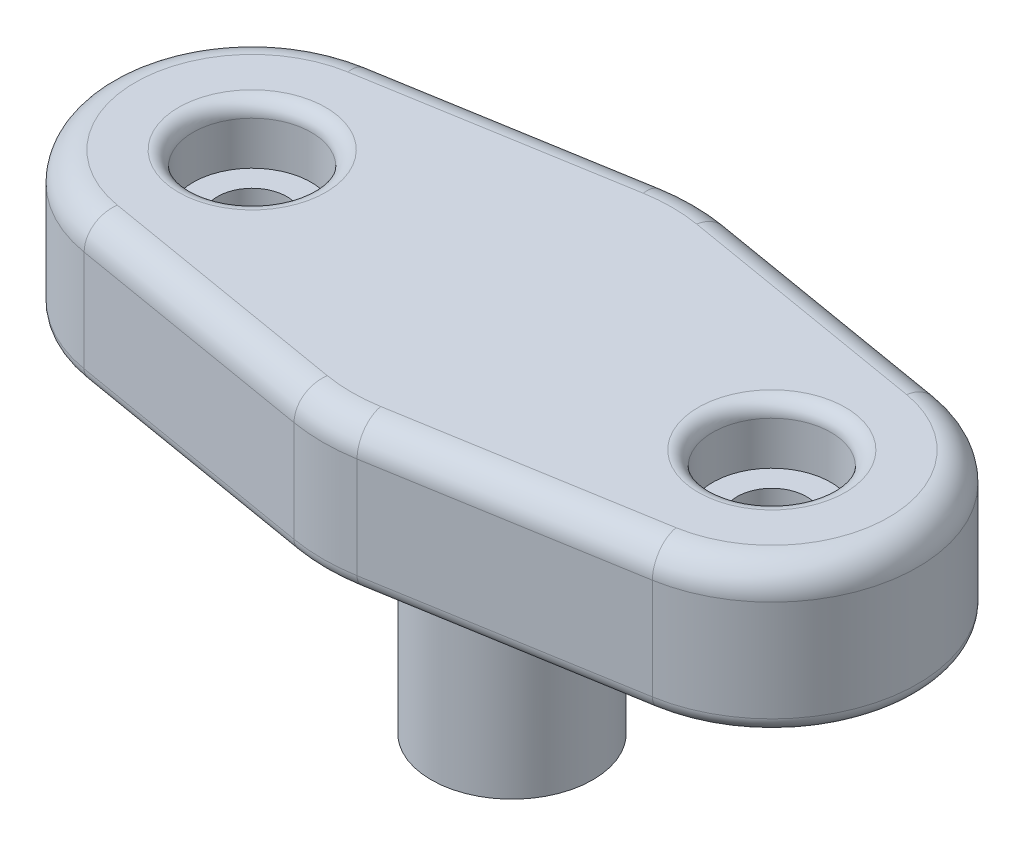
ISO-10303-21;
HEADER;
FILE_DESCRIPTION(('STEP AP214'),'2;1');
FILE_NAME('part.step','',(''),(''),'','','');
FILE_SCHEMA(('AUTOMOTIVE_DESIGN { 1 0 10303 214 1 1 1 1 }'));
ENDSEC;
DATA;
#1=APPLICATION_CONTEXT('core data for automotive mechanical design processes');
#2=APPLICATION_PROTOCOL_DEFINITION('international standard','automotive_design',2000,#1);
#3=PRODUCT_CONTEXT('',#1,'mechanical');
#4=PRODUCT('Part','Part','',(#3));
#5=PRODUCT_RELATED_PRODUCT_CATEGORY('part','',(#4));
#6=PRODUCT_DEFINITION_FORMATION('','',#4);
#7=PRODUCT_DEFINITION_CONTEXT('part definition',#1,'design');
#8=PRODUCT_DEFINITION('design','',#6,#7);
#9=PRODUCT_DEFINITION_SHAPE('','',#8);
#10=(LENGTH_UNIT() NAMED_UNIT(*) SI_UNIT(.MILLI.,.METRE.));
#11=(NAMED_UNIT(*) PLANE_ANGLE_UNIT() SI_UNIT($,.RADIAN.));
#12=(NAMED_UNIT(*) SI_UNIT($,.STERADIAN.) SOLID_ANGLE_UNIT());
#13=UNCERTAINTY_MEASURE_WITH_UNIT(LENGTH_MEASURE(1.E-05),#10,'distance_accuracy_value','');
#14=(GEOMETRIC_REPRESENTATION_CONTEXT(3) GLOBAL_UNCERTAINTY_ASSIGNED_CONTEXT((#13)) GLOBAL_UNIT_ASSIGNED_CONTEXT((#10,
#11,#12)) REPRESENTATION_CONTEXT('',''));
#15=CARTESIAN_POINT('',(0.,0.,0.));
#16=DIRECTION('',(0.,0.,1.));
#17=DIRECTION('',(1.,0.,0.));
#18=AXIS2_PLACEMENT_3D('',#15,#16,#17);
#19=CARTESIAN_POINT('',(9.,13.,0.));
#20=DIRECTION('',(0.,-1.,0.));
#21=DIRECTION('',(0.,0.,-1.));
#22=AXIS2_PLACEMENT_3D('',#19,#20,#21);
#23=CYLINDRICAL_SURFACE('',#22,1.2);
#24=CARTESIAN_POINT('',(9.,8.,0.));
#25=DIRECTION('',(0.,1.,0.));
#26=DIRECTION('',(0.,0.,1.));
#27=AXIS2_PLACEMENT_3D('',#24,#25,#26);
#28=CIRCLE('',#27,1.2);
#29=CARTESIAN_POINT('',(9.,8.,1.2));
#30=VERTEX_POINT('',#29);
#31=EDGE_CURVE('E527',#30,#30,#28,.T.);
#32=ORIENTED_EDGE('',*,*,#31,.F.);
#33=EDGE_LOOP('',(#32));
#34=FACE_BOUND('',#33,.T.);
#35=CARTESIAN_POINT('',(9.,11.,0.));
#36=DIRECTION('',(0.,1.,0.));
#37=DIRECTION('',(0.,0.,1.));
#38=AXIS2_PLACEMENT_3D('',#35,#36,#37);
#39=CIRCLE('',#38,1.2);
#40=CARTESIAN_POINT('',(9.,11.,1.2));
#41=VERTEX_POINT('',#40);
#42=EDGE_CURVE('E209',#41,#41,#39,.T.);
#43=ORIENTED_EDGE('',*,*,#42,.T.);
#44=EDGE_LOOP('',(#43));
#45=FACE_BOUND('',#44,.T.);
#46=ADVANCED_FACE('F45',(#34,#45),#23,.F.);
#47=CARTESIAN_POINT('',(-9.,13.,0.));
#48=DIRECTION('',(0.,-1.,0.));
#49=DIRECTION('',(0.,0.,-1.));
#50=AXIS2_PLACEMENT_3D('',#47,#48,#49);
#51=CYLINDRICAL_SURFACE('',#50,1.2);
#52=CARTESIAN_POINT('',(-9.,8.,0.));
#53=DIRECTION('',(0.,1.,0.));
#54=DIRECTION('',(0.,0.,1.));
#55=AXIS2_PLACEMENT_3D('',#52,#53,#54);
#56=CIRCLE('',#55,1.2);
#57=CARTESIAN_POINT('',(-9.,8.,1.2));
#58=VERTEX_POINT('',#57);
#59=EDGE_CURVE('E572',#58,#58,#56,.T.);
#60=ORIENTED_EDGE('',*,*,#59,.F.);
#61=EDGE_LOOP('',(#60));
#62=FACE_BOUND('',#61,.T.);
#63=CARTESIAN_POINT('',(-9.,11.,0.));
#64=DIRECTION('',(0.,1.,0.));
#65=DIRECTION('',(0.,0.,1.));
#66=AXIS2_PLACEMENT_3D('',#63,#64,#65);
#67=CIRCLE('',#66,1.2);
#68=CARTESIAN_POINT('',(-9.,11.,1.2));
#69=VERTEX_POINT('',#68);
#70=EDGE_CURVE('E563',#69,#69,#67,.T.);
#71=ORIENTED_EDGE('',*,*,#70,.T.);
#72=EDGE_LOOP('',(#71));
#73=FACE_BOUND('',#72,.T.);
#74=ADVANCED_FACE('F389',(#62,#73),#51,.F.);
#75=CARTESIAN_POINT('',(0.,8.,0.));
#76=DIRECTION('',(0.,-1.,0.));
#77=DIRECTION('',(0.,0.,-1.));
#78=AXIS2_PLACEMENT_3D('',#75,#76,#77);
#79=CYLINDRICAL_SURFACE('',#78,2.8);
#80=CARTESIAN_POINT('',(0.,8.,0.));
#81=DIRECTION('',(0.,1.,0.));
#82=DIRECTION('',(0.,0.,1.));
#83=AXIS2_PLACEMENT_3D('',#80,#81,#82);
#84=CIRCLE('',#83,2.8);
#85=CARTESIAN_POINT('',(0.,8.,2.8));
#86=VERTEX_POINT('',#85);
#87=EDGE_CURVE('E200',#86,#86,#84,.T.);
#88=ORIENTED_EDGE('',*,*,#87,.F.);
#89=EDGE_LOOP('',(#88));
#90=FACE_BOUND('',#89,.T.);
#91=CARTESIAN_POINT('',(0.,0.,0.));
#92=DIRECTION('',(0.,1.,0.));
#93=DIRECTION('',(0.,0.,1.));
#94=AXIS2_PLACEMENT_3D('',#91,#92,#93);
#95=CIRCLE('',#94,2.8);
#96=CARTESIAN_POINT('',(0.,0.,2.8));
#97=VERTEX_POINT('',#96);
#98=EDGE_CURVE('E168',#97,#97,#95,.T.);
#99=ORIENTED_EDGE('',*,*,#98,.T.);
#100=EDGE_LOOP('',(#99));
#101=FACE_BOUND('',#100,.T.);
#102=ADVANCED_FACE('F396',(#90,#101),#79,.T.);
#103=CARTESIAN_POINT('',(-9.,13.,0.));
#104=DIRECTION('',(0.,1.,0.));
#105=DIRECTION('',(0.,0.,1.));
#106=AXIS2_PLACEMENT_3D('',#103,#104,#105);
#107=PLANE('',#106);
#108=CARTESIAN_POINT('',(0.,13.,0.));
#109=DIRECTION('',(0.,1.,0.));
#110=DIRECTION('',(0.,0.,1.));
#111=AXIS2_PLACEMENT_3D('',#108,#109,#110);
#112=CIRCLE('',#111,5.55);
#113=CARTESIAN_POINT('',(0.925000000000002,13.,-5.47237379936714));
#114=VERTEX_POINT('',#113);
#115=CARTESIAN_POINT('',(-0.924999999999999,13.,-5.47237379936714));
#116=VERTEX_POINT('',#115);
#117=EDGE_CURVE('E311',#114,#116,#112,.T.);
#118=ORIENTED_EDGE('',*,*,#117,.T.);
#119=DIRECTION('',(-0.986013297183269,0.,0.166666666666667));
#120=VECTOR('',#119,1.);
#121=CARTESIAN_POINT('',(-9.675,13.,-3.99335385359224));
#122=LINE('',#121,#120);
#123=CARTESIAN_POINT('',(-9.675,13.,-3.99335385359224));
#124=VERTEX_POINT('',#123);
#125=EDGE_CURVE('E314',#116,#124,#122,.T.);
#126=ORIENTED_EDGE('',*,*,#125,.T.);
#127=CARTESIAN_POINT('',(-9.,13.,0.));
#128=DIRECTION('',(0.,1.,0.));
#129=DIRECTION('',(0.,0.,1.));
#130=AXIS2_PLACEMENT_3D('',#127,#128,#129);
#131=CIRCLE('',#130,4.05);
#132=CARTESIAN_POINT('',(-9.675,13.,3.99335385359224));
#133=VERTEX_POINT('',#132);
#134=EDGE_CURVE('E267',#124,#133,#131,.T.);
#135=ORIENTED_EDGE('',*,*,#134,.T.);
#136=DIRECTION('',(0.986013297183269,0.,0.166666666666666));
#137=VECTOR('',#136,1.);
#138=CARTESIAN_POINT('',(-0.925,13.,5.47237379936715));
#139=LINE('',#138,#137);
#140=CARTESIAN_POINT('',(-0.925,13.,5.47237379936715));
#141=VERTEX_POINT('',#140);
#142=EDGE_CURVE('E296',#133,#141,#139,.T.);
#143=ORIENTED_EDGE('',*,*,#142,.T.);
#144=CARTESIAN_POINT('',(0.,13.,0.));
#145=DIRECTION('',(0.,1.,0.));
#146=DIRECTION('',(0.,0.,1.));
#147=AXIS2_PLACEMENT_3D('',#144,#145,#146);
#148=CIRCLE('',#147,5.55);
#149=CARTESIAN_POINT('',(0.925000000000002,13.,5.47237379936714));
#150=VERTEX_POINT('',#149);
#151=EDGE_CURVE('E299',#141,#150,#148,.T.);
#152=ORIENTED_EDGE('',*,*,#151,.T.);
#153=DIRECTION('',(0.986013297183269,0.,-0.166666666666667));
#154=VECTOR('',#153,1.);
#155=CARTESIAN_POINT('',(9.675,13.,3.99335385359224));
#156=LINE('',#155,#154);
#157=CARTESIAN_POINT('',(9.675,13.,3.99335385359224));
#158=VERTEX_POINT('',#157);
#159=EDGE_CURVE('E302',#150,#158,#156,.T.);
#160=ORIENTED_EDGE('',*,*,#159,.T.);
#161=CARTESIAN_POINT('',(9.,13.,0.));
#162=DIRECTION('',(0.,1.,0.));
#163=DIRECTION('',(0.,0.,1.));
#164=AXIS2_PLACEMENT_3D('',#161,#162,#163);
#165=CIRCLE('',#164,4.05);
#166=CARTESIAN_POINT('',(9.675,13.,-3.99335385359224));
#167=VERTEX_POINT('',#166);
#168=EDGE_CURVE('E305',#158,#167,#165,.T.);
#169=ORIENTED_EDGE('',*,*,#168,.T.);
#170=DIRECTION('',(-0.986013297183269,0.,-0.166666666666667));
#171=VECTOR('',#170,1.);
#172=CARTESIAN_POINT('',(0.925000000000004,13.,-5.47237379936714));
#173=LINE('',#172,#171);
#174=EDGE_CURVE('E308',#167,#114,#173,.T.);
#175=ORIENTED_EDGE('',*,*,#174,.T.);
#176=EDGE_LOOP('',(#118,#126,#135,#143,#152,#160,#169,#175));
#177=FACE_BOUND('',#176,.T.);
#178=CARTESIAN_POINT('',(9.,13.,0.));
#179=DIRECTION('',(0.,1.,0.));
#180=DIRECTION('',(0.,0.,1.));
#181=AXIS2_PLACEMENT_3D('',#178,#179,#180);
#182=CIRCLE('',#181,2.55);
#183=CARTESIAN_POINT('',(9.,13.,2.55));
#184=VERTEX_POINT('',#183);
#185=EDGE_CURVE('E260',#184,#184,#182,.F.);
#186=ORIENTED_EDGE('',*,*,#185,.T.);
#187=EDGE_LOOP('',(#186));
#188=FACE_BOUND('',#187,.T.);
#189=CARTESIAN_POINT('',(-9.,13.,0.));
#190=DIRECTION('',(0.,1.,0.));
#191=DIRECTION('',(0.,0.,1.));
#192=AXIS2_PLACEMENT_3D('',#189,#190,#191);
#193=CIRCLE('',#192,2.55);
#194=CARTESIAN_POINT('',(-9.,13.,2.55));
#195=VERTEX_POINT('',#194);
#196=EDGE_CURVE('E256',#195,#195,#193,.F.);
#197=ORIENTED_EDGE('',*,*,#196,.T.);
#198=EDGE_LOOP('',(#197));
#199=FACE_BOUND('',#198,.T.);
#200=ADVANCED_FACE('F403',(#177,#188,#199),#107,.T.);
#201=CARTESIAN_POINT('',(-9.,8.,0.));
#202=DIRECTION('',(0.,1.,0.));
#203=DIRECTION('',(0.,0.,1.));
#204=AXIS2_PLACEMENT_3D('',#201,#202,#203);
#205=PLANE('',#204);
#206=DIRECTION('',(0.986013297183269,0.,0.166666666666666));
#207=VECTOR('',#206,1.);
#208=CARTESIAN_POINT('',(-9.75833333333333,8.,4.48636050218388));
#209=LINE('',#208,#207);
#210=CARTESIAN_POINT('',(-1.00833333333333,8.,5.96538044795878));
#211=VERTEX_POINT('',#210);
#212=CARTESIAN_POINT('',(-9.75833333333333,8.,4.48636050218388));
#213=VERTEX_POINT('',#212);
#214=EDGE_CURVE('E199',#211,#213,#209,.F.);
#215=ORIENTED_EDGE('',*,*,#214,.T.);
#216=CARTESIAN_POINT('',(-9.,8.,0.));
#217=DIRECTION('',(0.,1.,0.));
#218=DIRECTION('',(0.,0.,1.));
#219=AXIS2_PLACEMENT_3D('',#216,#217,#218);
#220=CIRCLE('',#219,4.55);
#221=CARTESIAN_POINT('',(-9.75833333333333,8.,-4.48636050218387));
#222=VERTEX_POINT('',#221);
#223=EDGE_CURVE('E179',#213,#222,#220,.F.);
#224=ORIENTED_EDGE('',*,*,#223,.T.);
#225=DIRECTION('',(-0.986013297183269,0.,0.166666666666667));
#226=VECTOR('',#225,1.);
#227=CARTESIAN_POINT('',(-9.75833333333333,8.,-4.48636050218387));
#228=LINE('',#227,#226);
#229=CARTESIAN_POINT('',(-1.00833333333333,8.,-5.96538044795878));
#230=VERTEX_POINT('',#229);
#231=EDGE_CURVE('E226',#222,#230,#228,.F.);
#232=ORIENTED_EDGE('',*,*,#231,.T.);
#233=CARTESIAN_POINT('',(0.,8.,0.));
#234=DIRECTION('',(0.,1.,0.));
#235=DIRECTION('',(0.,0.,1.));
#236=AXIS2_PLACEMENT_3D('',#233,#234,#235);
#237=CIRCLE('',#236,6.05);
#238=CARTESIAN_POINT('',(1.00833333333334,8.,-5.96538044795878));
#239=VERTEX_POINT('',#238);
#240=EDGE_CURVE('E223',#230,#239,#237,.F.);
#241=ORIENTED_EDGE('',*,*,#240,.T.);
#242=DIRECTION('',(-0.986013297183269,0.,-0.166666666666667));
#243=VECTOR('',#242,1.);
#244=CARTESIAN_POINT('',(-7.74166666666666,8.,-7.44440039373368));
#245=LINE('',#244,#243);
#246=CARTESIAN_POINT('',(9.75833333333334,8.,-4.48636050218387));
#247=VERTEX_POINT('',#246);
#248=EDGE_CURVE('E220',#239,#247,#245,.F.);
#249=ORIENTED_EDGE('',*,*,#248,.T.);
#250=CARTESIAN_POINT('',(9.,8.,0.));
#251=DIRECTION('',(0.,1.,0.));
#252=DIRECTION('',(0.,0.,1.));
#253=AXIS2_PLACEMENT_3D('',#250,#251,#252);
#254=CIRCLE('',#253,4.55);
#255=CARTESIAN_POINT('',(9.75833333333333,8.,4.48636050218387));
#256=VERTEX_POINT('',#255);
#257=EDGE_CURVE('E217',#247,#256,#254,.F.);
#258=ORIENTED_EDGE('',*,*,#257,.T.);
#259=DIRECTION('',(0.986013297183269,0.,-0.166666666666667));
#260=VECTOR('',#259,1.);
#261=CARTESIAN_POINT('',(-7.74166666666666,8.,7.44440039373368));
#262=LINE('',#261,#260);
#263=CARTESIAN_POINT('',(1.00833333333334,8.,5.96538044795878));
#264=VERTEX_POINT('',#263);
#265=EDGE_CURVE('E214',#256,#264,#262,.F.);
#266=ORIENTED_EDGE('',*,*,#265,.T.);
#267=CARTESIAN_POINT('',(0.,8.,0.));
#268=DIRECTION('',(0.,1.,0.));
#269=DIRECTION('',(0.,0.,1.));
#270=AXIS2_PLACEMENT_3D('',#267,#268,#269);
#271=CIRCLE('',#270,6.05);
#272=EDGE_CURVE('E204',#264,#211,#271,.F.);
#273=ORIENTED_EDGE('',*,*,#272,.T.);
#274=EDGE_LOOP('',(#215,#224,#232,#241,#249,#258,#266,#273));
#275=FACE_BOUND('',#274,.T.);
#276=ORIENTED_EDGE('',*,*,#87,.T.);
#277=EDGE_LOOP('',(#276));
#278=FACE_BOUND('',#277,.T.);
#279=ORIENTED_EDGE('',*,*,#31,.T.);
#280=EDGE_LOOP('',(#279));
#281=FACE_BOUND('',#280,.T.);
#282=ORIENTED_EDGE('',*,*,#59,.T.);
#283=EDGE_LOOP('',(#282));
#284=FACE_BOUND('',#283,.T.);
#285=ADVANCED_FACE('F406',(#275,#278,#281,#284),#205,.F.);
#286=CARTESIAN_POINT('',(-9.,13.,0.));
#287=DIRECTION('',(0.,-1.,0.));
#288=DIRECTION('',(0.,0.,-1.));
#289=AXIS2_PLACEMENT_3D('',#286,#287,#288);
#290=CYLINDRICAL_SURFACE('',#289,5.05);
#291=DIRECTION('',(0.,-1.,0.));
#292=VECTOR('',#291,1.);
#293=CARTESIAN_POINT('',(-9.84166666666667,13.,4.97936715077551));
#294=LINE('',#293,#292);
#295=CARTESIAN_POINT('',(-9.84166666666667,12.,4.97936715077551));
#296=VERTEX_POINT('',#295);
#297=CARTESIAN_POINT('',(-9.84166666666667,8.5,4.97936715077551));
#298=VERTEX_POINT('',#297);
#299=EDGE_CURVE('E158',#296,#298,#294,.T.);
#300=ORIENTED_EDGE('',*,*,#299,.F.);
#301=CARTESIAN_POINT('',(-9.,12.,0.));
#302=DIRECTION('',(0.,1.,0.));
#303=DIRECTION('',(0.,0.,1.));
#304=AXIS2_PLACEMENT_3D('',#301,#302,#303);
#305=CIRCLE('',#304,5.05);
#306=CARTESIAN_POINT('',(-9.84166666666667,12.,-4.97936715077551));
#307=VERTEX_POINT('',#306);
#308=EDGE_CURVE('E338',#296,#307,#305,.F.);
#309=ORIENTED_EDGE('',*,*,#308,.T.);
#310=DIRECTION('',(0.,-1.,0.));
#311=VECTOR('',#310,1.);
#312=CARTESIAN_POINT('',(-9.84166666666667,13.,-4.97936715077551));
#313=LINE('',#312,#311);
#314=CARTESIAN_POINT('',(-9.84166666666667,8.5,-4.97936715077551));
#315=VERTEX_POINT('',#314);
#316=EDGE_CURVE('E196',#307,#315,#313,.T.);
#317=ORIENTED_EDGE('',*,*,#316,.T.);
#318=CARTESIAN_POINT('',(-9.,8.5,0.));
#319=DIRECTION('',(0.,1.,0.));
#320=DIRECTION('',(0.,0.,1.));
#321=AXIS2_PLACEMENT_3D('',#318,#319,#320);
#322=CIRCLE('',#321,5.05);
#323=EDGE_CURVE('E177',#315,#298,#322,.T.);
#324=ORIENTED_EDGE('',*,*,#323,.T.);
#325=EDGE_LOOP('',(#300,#309,#317,#324));
#326=FACE_BOUND('',#325,.T.);
#327=ADVANCED_FACE('F194',(#326),#290,.T.);
#328=CARTESIAN_POINT('',(-1.09166666666667,13.,6.45838709655041));
#329=DIRECTION('',(0.166666666666666,0.,-0.986013297183269));
#330=DIRECTION('',(-0.986013297183269,0.,-0.166666666666666));
#331=AXIS2_PLACEMENT_3D('',#328,#329,#330);
#332=PLANE('',#331);
#333=DIRECTION('',(0.,-1.,0.));
#334=VECTOR('',#333,1.);
#335=CARTESIAN_POINT('',(-1.09166666666667,13.,6.45838709655041));
#336=LINE('',#335,#334);
#337=CARTESIAN_POINT('',(-1.09166666666667,12.,6.45838709655041));
#338=VERTEX_POINT('',#337);
#339=CARTESIAN_POINT('',(-1.09166666666667,8.5,6.45838709655041));
#340=VERTEX_POINT('',#339);
#341=EDGE_CURVE('E169',#338,#340,#336,.T.);
#342=ORIENTED_EDGE('',*,*,#341,.F.);
#343=DIRECTION('',(0.986013297183269,0.,0.166666666666666));
#344=VECTOR('',#343,1.);
#345=CARTESIAN_POINT('',(-9.84166666666667,12.,4.97936715077551));
#346=LINE('',#345,#344);
#347=EDGE_CURVE('E61',#338,#296,#346,.F.);
#348=ORIENTED_EDGE('',*,*,#347,.T.);
#349=ORIENTED_EDGE('',*,*,#299,.T.);
#350=DIRECTION('',(0.986013297183269,0.,0.166666666666666));
#351=VECTOR('',#350,1.);
#352=CARTESIAN_POINT('',(-1.09166666666667,8.5,6.45838709655041));
#353=LINE('',#352,#351);
#354=EDGE_CURVE('E162',#298,#340,#353,.T.);
#355=ORIENTED_EDGE('',*,*,#354,.T.);
#356=EDGE_LOOP('',(#342,#348,#349,#355));
#357=FACE_BOUND('',#356,.T.);
#358=ADVANCED_FACE('F160',(#357),#332,.F.);
#359=CARTESIAN_POINT('',(0.,13.,0.));
#360=DIRECTION('',(0.,-1.,0.));
#361=DIRECTION('',(0.,0.,-1.));
#362=AXIS2_PLACEMENT_3D('',#359,#360,#361);
#363=CYLINDRICAL_SURFACE('',#362,6.55);
#364=DIRECTION('',(0.,-1.,0.));
#365=VECTOR('',#364,1.);
#366=CARTESIAN_POINT('',(1.09166666666667,13.,6.45838709655041));
#367=LINE('',#366,#365);
#368=CARTESIAN_POINT('',(1.09166666666667,12.,6.45838709655041));
#369=VERTEX_POINT('',#368);
#370=CARTESIAN_POINT('',(1.09166666666667,8.5,6.45838709655041));
#371=VERTEX_POINT('',#370);
#372=EDGE_CURVE('E552',#369,#371,#367,.T.);
#373=ORIENTED_EDGE('',*,*,#372,.F.);
#374=CARTESIAN_POINT('',(0.,12.,0.));
#375=DIRECTION('',(0.,1.,0.));
#376=DIRECTION('',(0.,0.,1.));
#377=AXIS2_PLACEMENT_3D('',#374,#375,#376);
#378=CIRCLE('',#377,6.55);
#379=EDGE_CURVE('E69',#369,#338,#378,.F.);
#380=ORIENTED_EDGE('',*,*,#379,.T.);
#381=ORIENTED_EDGE('',*,*,#341,.T.);
#382=CARTESIAN_POINT('',(0.,8.5,0.));
#383=DIRECTION('',(0.,1.,0.));
#384=DIRECTION('',(0.,0.,1.));
#385=AXIS2_PLACEMENT_3D('',#382,#383,#384);
#386=CIRCLE('',#385,6.55);
#387=EDGE_CURVE('E192',#340,#371,#386,.T.);
#388=ORIENTED_EDGE('',*,*,#387,.T.);
#389=EDGE_LOOP('',(#373,#380,#381,#388));
#390=FACE_BOUND('',#389,.T.);
#391=ADVANCED_FACE('F431',(#390),#363,.T.);
#392=CARTESIAN_POINT('',(9.84166666666667,13.,4.97936715077551));
#393=DIRECTION('',(-0.166666666666667,0.,-0.986013297183269));
#394=DIRECTION('',(-0.986013297183269,0.,0.166666666666667));
#395=AXIS2_PLACEMENT_3D('',#392,#393,#394);
#396=PLANE('',#395);
#397=DIRECTION('',(0.,-1.,0.));
#398=VECTOR('',#397,1.);
#399=CARTESIAN_POINT('',(9.84166666666667,13.,4.97936715077551));
#400=LINE('',#399,#398);
#401=CARTESIAN_POINT('',(9.84166666666667,12.,4.97936715077551));
#402=VERTEX_POINT('',#401);
#403=CARTESIAN_POINT('',(9.84166666666667,8.5,4.97936715077551));
#404=VERTEX_POINT('',#403);
#405=EDGE_CURVE('E548',#402,#404,#400,.T.);
#406=ORIENTED_EDGE('',*,*,#405,.F.);
#407=DIRECTION('',(0.986013297183269,0.,-0.166666666666667));
#408=VECTOR('',#407,1.);
#409=CARTESIAN_POINT('',(1.09166666666667,12.,6.45838709655041));
#410=LINE('',#409,#408);
#411=EDGE_CURVE('E331',#402,#369,#410,.F.);
#412=ORIENTED_EDGE('',*,*,#411,.T.);
#413=ORIENTED_EDGE('',*,*,#372,.T.);
#414=DIRECTION('',(0.986013297183269,0.,-0.166666666666667));
#415=VECTOR('',#414,1.);
#416=CARTESIAN_POINT('',(9.84166666666667,8.5,4.97936715077551));
#417=LINE('',#416,#415);
#418=EDGE_CURVE('E246',#371,#404,#417,.T.);
#419=ORIENTED_EDGE('',*,*,#418,.T.);
#420=EDGE_LOOP('',(#406,#412,#413,#419));
#421=FACE_BOUND('',#420,.T.);
#422=ADVANCED_FACE('F427',(#421),#396,.F.);
#423=CARTESIAN_POINT('',(9.,13.,0.));
#424=DIRECTION('',(0.,-1.,0.));
#425=DIRECTION('',(0.,0.,-1.));
#426=AXIS2_PLACEMENT_3D('',#423,#424,#425);
#427=CYLINDRICAL_SURFACE('',#426,5.05);
#428=DIRECTION('',(0.,-1.,0.));
#429=VECTOR('',#428,1.);
#430=CARTESIAN_POINT('',(9.84166666666667,13.,-4.9793671507755));
#431=LINE('',#430,#429);
#432=CARTESIAN_POINT('',(9.84166666666667,12.,-4.9793671507755));
#433=VERTEX_POINT('',#432);
#434=CARTESIAN_POINT('',(9.84166666666667,8.5,-4.9793671507755));
#435=VERTEX_POINT('',#434);
#436=EDGE_CURVE('E541',#433,#435,#431,.T.);
#437=ORIENTED_EDGE('',*,*,#436,.F.);
#438=CARTESIAN_POINT('',(9.,12.,0.));
#439=DIRECTION('',(0.,1.,0.));
#440=DIRECTION('',(0.,0.,1.));
#441=AXIS2_PLACEMENT_3D('',#438,#439,#440);
#442=CIRCLE('',#441,5.05);
#443=EDGE_CURVE('E328',#433,#402,#442,.F.);
#444=ORIENTED_EDGE('',*,*,#443,.T.);
#445=ORIENTED_EDGE('',*,*,#405,.T.);
#446=CARTESIAN_POINT('',(9.,8.5,0.));
#447=DIRECTION('',(0.,1.,0.));
#448=DIRECTION('',(0.,0.,1.));
#449=AXIS2_PLACEMENT_3D('',#446,#447,#448);
#450=CIRCLE('',#449,5.05);
#451=EDGE_CURVE('E242',#404,#435,#450,.T.);
#452=ORIENTED_EDGE('',*,*,#451,.T.);
#453=EDGE_LOOP('',(#437,#444,#445,#452));
#454=FACE_BOUND('',#453,.T.);
#455=ADVANCED_FACE('F423',(#454),#427,.T.);
#456=CARTESIAN_POINT('',(1.09166666666667,13.,-6.45838709655041));
#457=DIRECTION('',(-0.166666666666667,0.,0.986013297183269));
#458=DIRECTION('',(0.986013297183269,0.,0.166666666666667));
#459=AXIS2_PLACEMENT_3D('',#456,#457,#458);
#460=PLANE('',#459);
#461=DIRECTION('',(0.,-1.,0.));
#462=VECTOR('',#461,1.);
#463=CARTESIAN_POINT('',(1.09166666666667,13.,-6.45838709655041));
#464=LINE('',#463,#462);
#465=CARTESIAN_POINT('',(1.09166666666667,12.,-6.45838709655041));
#466=VERTEX_POINT('',#465);
#467=CARTESIAN_POINT('',(1.09166666666667,8.5,-6.45838709655041));
#468=VERTEX_POINT('',#467);
#469=EDGE_CURVE('E535',#466,#468,#464,.T.);
#470=ORIENTED_EDGE('',*,*,#469,.F.);
#471=DIRECTION('',(-0.986013297183269,0.,-0.166666666666667));
#472=VECTOR('',#471,1.);
#473=CARTESIAN_POINT('',(9.84166666666667,12.,-4.9793671507755));
#474=LINE('',#473,#472);
#475=EDGE_CURVE('E325',#466,#433,#474,.F.);
#476=ORIENTED_EDGE('',*,*,#475,.T.);
#477=ORIENTED_EDGE('',*,*,#436,.T.);
#478=DIRECTION('',(-0.986013297183269,0.,-0.166666666666667));
#479=VECTOR('',#478,1.);
#480=CARTESIAN_POINT('',(1.09166666666667,8.5,-6.45838709655041));
#481=LINE('',#480,#479);
#482=EDGE_CURVE('E238',#435,#468,#481,.T.);
#483=ORIENTED_EDGE('',*,*,#482,.T.);
#484=EDGE_LOOP('',(#470,#476,#477,#483));
#485=FACE_BOUND('',#484,.T.);
#486=ADVANCED_FACE('F419',(#485),#460,.F.);
#487=CARTESIAN_POINT('',(0.,13.,0.));
#488=DIRECTION('',(0.,-1.,0.));
#489=DIRECTION('',(0.,0.,-1.));
#490=AXIS2_PLACEMENT_3D('',#487,#488,#489);
#491=CYLINDRICAL_SURFACE('',#490,6.55);
#492=DIRECTION('',(0.,-1.,0.));
#493=VECTOR('',#492,1.);
#494=CARTESIAN_POINT('',(-1.09166666666667,13.,-6.45838709655041));
#495=LINE('',#494,#493);
#496=CARTESIAN_POINT('',(-1.09166666666667,12.,-6.45838709655041));
#497=VERTEX_POINT('',#496);
#498=CARTESIAN_POINT('',(-1.09166666666667,8.5,-6.45838709655041));
#499=VERTEX_POINT('',#498);
#500=EDGE_CURVE('E526',#497,#499,#495,.T.);
#501=ORIENTED_EDGE('',*,*,#500,.F.);
#502=CARTESIAN_POINT('',(0.,12.,0.));
#503=DIRECTION('',(0.,1.,0.));
#504=DIRECTION('',(0.,0.,1.));
#505=AXIS2_PLACEMENT_3D('',#502,#503,#504);
#506=CIRCLE('',#505,6.55);
#507=EDGE_CURVE('E322',#497,#466,#506,.F.);
#508=ORIENTED_EDGE('',*,*,#507,.T.);
#509=ORIENTED_EDGE('',*,*,#469,.T.);
#510=CARTESIAN_POINT('',(0.,8.5,0.));
#511=DIRECTION('',(0.,1.,0.));
#512=DIRECTION('',(0.,0.,1.));
#513=AXIS2_PLACEMENT_3D('',#510,#511,#512);
#514=CIRCLE('',#513,6.55);
#515=EDGE_CURVE('E234',#468,#499,#514,.T.);
#516=ORIENTED_EDGE('',*,*,#515,.T.);
#517=EDGE_LOOP('',(#501,#508,#509,#516));
#518=FACE_BOUND('',#517,.T.);
#519=ADVANCED_FACE('F415',(#518),#491,.T.);
#520=CARTESIAN_POINT('',(-9.84166666666667,13.,-4.97936715077551));
#521=DIRECTION('',(0.166666666666667,0.,0.986013297183269));
#522=DIRECTION('',(0.986013297183269,0.,-0.166666666666667));
#523=AXIS2_PLACEMENT_3D('',#520,#521,#522);
#524=PLANE('',#523);
#525=ORIENTED_EDGE('',*,*,#316,.F.);
#526=DIRECTION('',(-0.986013297183269,0.,0.166666666666667));
#527=VECTOR('',#526,1.);
#528=CARTESIAN_POINT('',(-1.09166666666667,12.,-6.45838709655041));
#529=LINE('',#528,#527);
#530=EDGE_CURVE('E318',#307,#497,#529,.F.);
#531=ORIENTED_EDGE('',*,*,#530,.T.);
#532=ORIENTED_EDGE('',*,*,#500,.T.);
#533=DIRECTION('',(-0.986013297183269,0.,0.166666666666667));
#534=VECTOR('',#533,1.);
#535=CARTESIAN_POINT('',(-9.84166666666667,8.5,-4.97936715077551));
#536=LINE('',#535,#534);
#537=EDGE_CURVE('E231',#499,#315,#536,.T.);
#538=ORIENTED_EDGE('',*,*,#537,.T.);
#539=EDGE_LOOP('',(#525,#531,#532,#538));
#540=FACE_BOUND('',#539,.T.);
#541=ADVANCED_FACE('F411',(#540),#524,.F.);
#542=CARTESIAN_POINT('',(-9.,11.,0.));
#543=DIRECTION('',(0.,1.,0.));
#544=DIRECTION('',(0.,0.,1.));
#545=AXIS2_PLACEMENT_3D('',#542,#543,#544);
#546=CYLINDRICAL_SURFACE('',#545,2.05);
#547=CARTESIAN_POINT('',(-9.,12.5,0.));
#548=DIRECTION('',(0.,1.,0.));
#549=DIRECTION('',(0.,0.,1.));
#550=AXIS2_PLACEMENT_3D('',#547,#548,#549);
#551=CIRCLE('',#550,2.05);
#552=CARTESIAN_POINT('',(-9.,12.5,2.05));
#553=VERTEX_POINT('',#552);
#554=EDGE_CURVE('E264',#553,#553,#551,.T.);
#555=ORIENTED_EDGE('',*,*,#554,.T.);
#556=EDGE_LOOP('',(#555));
#557=FACE_BOUND('',#556,.T.);
#558=CARTESIAN_POINT('',(-9.,11.,0.));
#559=DIRECTION('',(0.,1.,0.));
#560=DIRECTION('',(0.,0.,1.));
#561=AXIS2_PLACEMENT_3D('',#558,#559,#560);
#562=CIRCLE('',#561,2.05);
#563=CARTESIAN_POINT('',(-9.,11.,2.05));
#564=VERTEX_POINT('',#563);
#565=EDGE_CURVE('E566',#564,#564,#562,.T.);
#566=ORIENTED_EDGE('',*,*,#565,.F.);
#567=EDGE_LOOP('',(#566));
#568=FACE_BOUND('',#567,.T.);
#569=ADVANCED_FACE('F414',(#557,#568),#546,.F.);
#570=CARTESIAN_POINT('',(-9.,11.,0.));
#571=DIRECTION('',(0.,1.,0.));
#572=DIRECTION('',(0.,0.,1.));
#573=AXIS2_PLACEMENT_3D('',#570,#571,#572);
#574=PLANE('',#573);
#575=ORIENTED_EDGE('',*,*,#70,.F.);
#576=EDGE_LOOP('',(#575));
#577=FACE_BOUND('',#576,.T.);
#578=ORIENTED_EDGE('',*,*,#565,.T.);
#579=EDGE_LOOP('',(#578));
#580=FACE_BOUND('',#579,.T.);
#581=ADVANCED_FACE('F610',(#577,#580),#574,.T.);
#582=CARTESIAN_POINT('',(9.,11.,0.));
#583=DIRECTION('',(0.,1.,0.));
#584=DIRECTION('',(0.,0.,1.));
#585=AXIS2_PLACEMENT_3D('',#582,#583,#584);
#586=CYLINDRICAL_SURFACE('',#585,2.05);
#587=CARTESIAN_POINT('',(9.,12.5,0.));
#588=DIRECTION('',(0.,1.,0.));
#589=DIRECTION('',(0.,0.,1.));
#590=AXIS2_PLACEMENT_3D('',#587,#588,#589);
#591=CIRCLE('',#590,2.05);
#592=CARTESIAN_POINT('',(9.,12.5,2.05));
#593=VERTEX_POINT('',#592);
#594=EDGE_CURVE('E191',#593,#593,#591,.T.);
#595=ORIENTED_EDGE('',*,*,#594,.T.);
#596=EDGE_LOOP('',(#595));
#597=FACE_BOUND('',#596,.T.);
#598=CARTESIAN_POINT('',(9.,11.,0.));
#599=DIRECTION('',(0.,1.,0.));
#600=DIRECTION('',(0.,0.,1.));
#601=AXIS2_PLACEMENT_3D('',#598,#599,#600);
#602=CIRCLE('',#601,2.05);
#603=CARTESIAN_POINT('',(9.,11.,2.05));
#604=VERTEX_POINT('',#603);
#605=EDGE_CURVE('E293',#604,#604,#602,.T.);
#606=ORIENTED_EDGE('',*,*,#605,.F.);
#607=EDGE_LOOP('',(#606));
#608=FACE_BOUND('',#607,.T.);
#609=ADVANCED_FACE('F608',(#597,#608),#586,.F.);
#610=CARTESIAN_POINT('',(9.,11.,0.));
#611=DIRECTION('',(0.,1.,0.));
#612=DIRECTION('',(0.,0.,1.));
#613=AXIS2_PLACEMENT_3D('',#610,#611,#612);
#614=PLANE('',#613);
#615=ORIENTED_EDGE('',*,*,#42,.F.);
#616=EDGE_LOOP('',(#615));
#617=FACE_BOUND('',#616,.T.);
#618=ORIENTED_EDGE('',*,*,#605,.T.);
#619=EDGE_LOOP('',(#618));
#620=FACE_BOUND('',#619,.T.);
#621=ADVANCED_FACE('F469',(#617,#620),#614,.T.);
#622=CARTESIAN_POINT('',(9.,8.5,0.));
#623=DIRECTION('',(0.,1.,0.));
#624=DIRECTION('',(0.,0.,1.));
#625=AXIS2_PLACEMENT_3D('',#622,#623,#624);
#626=TOROIDAL_SURFACE('',#625,4.55,0.5);
#627=CARTESIAN_POINT('',(9.75833333333333,8.5,4.48636050218387));
#628=DIRECTION('',(-0.98601329718327,0.,0.166666666666665));
#629=DIRECTION('',(0.166666666666665,0.,0.98601329718327));
#630=AXIS2_PLACEMENT_3D('',#627,#628,#629);
#631=CIRCLE('',#630,0.5);
#632=EDGE_CURVE('E285',#256,#404,#631,.T.);
#633=ORIENTED_EDGE('',*,*,#632,.F.);
#634=ORIENTED_EDGE('',*,*,#257,.F.);
#635=CARTESIAN_POINT('',(9.75833333333334,8.5,-4.48636050218387));
#636=DIRECTION('',(-0.986013297183269,0.,-0.166666666666666));
#637=DIRECTION('',(-0.166666666666666,0.,0.98601329718327));
#638=AXIS2_PLACEMENT_3D('',#635,#636,#637);
#639=CIRCLE('',#638,0.5);
#640=EDGE_CURVE('E289',#435,#247,#639,.T.);
#641=ORIENTED_EDGE('',*,*,#640,.F.);
#642=ORIENTED_EDGE('',*,*,#451,.F.);
#643=EDGE_LOOP('',(#633,#634,#641,#642));
#644=FACE_BOUND('',#643,.T.);
#645=ADVANCED_FACE('F465',(#644),#626,.T.);
#646=CARTESIAN_POINT('',(1.00833333333334,8.5,-5.96538044795878));
#647=DIRECTION('',(-0.986013297183269,0.,-0.166666666666667));
#648=DIRECTION('',(-0.166666666666667,0.,0.986013297183269));
#649=AXIS2_PLACEMENT_3D('',#646,#647,#648);
#650=CYLINDRICAL_SURFACE('',#649,0.5);
#651=ORIENTED_EDGE('',*,*,#640,.T.);
#652=ORIENTED_EDGE('',*,*,#248,.F.);
#653=CARTESIAN_POINT('',(1.00833333333334,8.5,-5.96538044795878));
#654=DIRECTION('',(-0.986013297183269,0.,-0.166666666666667));
#655=DIRECTION('',(-0.166666666666667,0.,0.986013297183269));
#656=AXIS2_PLACEMENT_3D('',#653,#654,#655);
#657=CIRCLE('',#656,0.5);
#658=EDGE_CURVE('E281',#468,#239,#657,.T.);
#659=ORIENTED_EDGE('',*,*,#658,.F.);
#660=ORIENTED_EDGE('',*,*,#482,.F.);
#661=EDGE_LOOP('',(#651,#652,#659,#660));
#662=FACE_BOUND('',#661,.T.);
#663=ADVANCED_FACE('F461',(#662),#650,.T.);
#664=CARTESIAN_POINT('',(9.75833333333333,8.5,4.48636050218387));
#665=DIRECTION('',(0.986013297183269,0.,-0.166666666666667));
#666=DIRECTION('',(-0.166666666666667,0.,-0.986013297183269));
#667=AXIS2_PLACEMENT_3D('',#664,#665,#666);
#668=CYLINDRICAL_SURFACE('',#667,0.5);
#669=ORIENTED_EDGE('',*,*,#632,.T.);
#670=ORIENTED_EDGE('',*,*,#418,.F.);
#671=CARTESIAN_POINT('',(1.00833333333334,8.5,5.96538044795878));
#672=DIRECTION('',(-0.986013297183269,0.,0.166666666666667));
#673=DIRECTION('',(0.166666666666667,0.,0.986013297183269));
#674=AXIS2_PLACEMENT_3D('',#671,#672,#673);
#675=CIRCLE('',#674,0.5);
#676=EDGE_CURVE('E277',#264,#371,#675,.T.);
#677=ORIENTED_EDGE('',*,*,#676,.F.);
#678=ORIENTED_EDGE('',*,*,#265,.F.);
#679=EDGE_LOOP('',(#669,#670,#677,#678));
#680=FACE_BOUND('',#679,.T.);
#681=ADVANCED_FACE('F457',(#680),#668,.T.);
#682=CARTESIAN_POINT('',(0.,8.5,0.));
#683=DIRECTION('',(0.,1.,0.));
#684=DIRECTION('',(0.,0.,1.));
#685=AXIS2_PLACEMENT_3D('',#682,#683,#684);
#686=TOROIDAL_SURFACE('',#685,6.05,0.5);
#687=ORIENTED_EDGE('',*,*,#658,.T.);
#688=ORIENTED_EDGE('',*,*,#240,.F.);
#689=CARTESIAN_POINT('',(-1.00833333333333,8.5,-5.96538044795878));
#690=DIRECTION('',(-0.986013297183269,0.,0.166666666666666));
#691=DIRECTION('',(0.166666666666666,0.,0.986013297183269));
#692=AXIS2_PLACEMENT_3D('',#689,#690,#691);
#693=CIRCLE('',#692,0.5);
#694=EDGE_CURVE('E273',#499,#230,#693,.T.);
#695=ORIENTED_EDGE('',*,*,#694,.F.);
#696=ORIENTED_EDGE('',*,*,#515,.F.);
#697=EDGE_LOOP('',(#687,#688,#695,#696));
#698=FACE_BOUND('',#697,.T.);
#699=ADVANCED_FACE('F453',(#698),#686,.T.);
#700=CARTESIAN_POINT('',(0.,8.5,0.));
#701=DIRECTION('',(0.,1.,0.));
#702=DIRECTION('',(0.,0.,1.));
#703=AXIS2_PLACEMENT_3D('',#700,#701,#702);
#704=TOROIDAL_SURFACE('',#703,6.05,0.5);
#705=ORIENTED_EDGE('',*,*,#676,.T.);
#706=ORIENTED_EDGE('',*,*,#387,.F.);
#707=CARTESIAN_POINT('',(-1.00833333333333,8.5,5.96538044795878));
#708=DIRECTION('',(-0.986013297183269,0.,-0.166666666666667));
#709=DIRECTION('',(-0.166666666666667,0.,0.986013297183269));
#710=AXIS2_PLACEMENT_3D('',#707,#708,#709);
#711=CIRCLE('',#710,0.5);
#712=EDGE_CURVE('E189',#211,#340,#711,.T.);
#713=ORIENTED_EDGE('',*,*,#712,.F.);
#714=ORIENTED_EDGE('',*,*,#272,.F.);
#715=EDGE_LOOP('',(#705,#706,#713,#714));
#716=FACE_BOUND('',#715,.T.);
#717=ADVANCED_FACE('F449',(#716),#704,.T.);
#718=CARTESIAN_POINT('',(-9.75833333333333,8.5,-4.48636050218387));
#719=DIRECTION('',(-0.986013297183269,0.,0.166666666666667));
#720=DIRECTION('',(0.166666666666667,0.,0.986013297183269));
#721=AXIS2_PLACEMENT_3D('',#718,#719,#720);
#722=CYLINDRICAL_SURFACE('',#721,0.5);
#723=ORIENTED_EDGE('',*,*,#694,.T.);
#724=ORIENTED_EDGE('',*,*,#231,.F.);
#725=CARTESIAN_POINT('',(-9.75833333333333,8.5,-4.48636050218387));
#726=DIRECTION('',(-0.986013297183269,0.,0.166666666666666));
#727=DIRECTION('',(0.166666666666666,0.,0.98601329718327));
#728=AXIS2_PLACEMENT_3D('',#725,#726,#727);
#729=CIRCLE('',#728,0.5);
#730=EDGE_CURVE('E183',#315,#222,#729,.T.);
#731=ORIENTED_EDGE('',*,*,#730,.F.);
#732=ORIENTED_EDGE('',*,*,#537,.F.);
#733=EDGE_LOOP('',(#723,#724,#731,#732));
#734=FACE_BOUND('',#733,.T.);
#735=ADVANCED_FACE('F446',(#734),#722,.T.);
#736=CARTESIAN_POINT('',(-1.00833333333333,8.5,5.96538044795878));
#737=DIRECTION('',(0.986013297183269,0.,0.166666666666666));
#738=DIRECTION('',(0.166666666666666,0.,-0.986013297183269));
#739=AXIS2_PLACEMENT_3D('',#736,#737,#738);
#740=CYLINDRICAL_SURFACE('',#739,0.5);
#741=ORIENTED_EDGE('',*,*,#712,.T.);
#742=ORIENTED_EDGE('',*,*,#354,.F.);
#743=CARTESIAN_POINT('',(-9.75833333333333,8.5,4.48636050218388));
#744=DIRECTION('',(-0.98601329718327,0.,-0.166666666666665));
#745=DIRECTION('',(-0.166666666666665,0.,0.98601329718327));
#746=AXIS2_PLACEMENT_3D('',#743,#744,#745);
#747=CIRCLE('',#746,0.5);
#748=EDGE_CURVE('E175',#213,#298,#747,.T.);
#749=ORIENTED_EDGE('',*,*,#748,.F.);
#750=ORIENTED_EDGE('',*,*,#214,.F.);
#751=EDGE_LOOP('',(#741,#742,#749,#750));
#752=FACE_BOUND('',#751,.T.);
#753=ADVANCED_FACE('F187',(#752),#740,.T.);
#754=CARTESIAN_POINT('',(-9.,8.5,0.));
#755=DIRECTION('',(0.,1.,0.));
#756=DIRECTION('',(0.,0.,1.));
#757=AXIS2_PLACEMENT_3D('',#754,#755,#756);
#758=TOROIDAL_SURFACE('',#757,4.55,0.5);
#759=ORIENTED_EDGE('',*,*,#730,.T.);
#760=ORIENTED_EDGE('',*,*,#223,.F.);
#761=ORIENTED_EDGE('',*,*,#748,.T.);
#762=ORIENTED_EDGE('',*,*,#323,.F.);
#763=EDGE_LOOP('',(#759,#760,#761,#762));
#764=FACE_BOUND('',#763,.T.);
#765=ADVANCED_FACE('F176',(#764),#758,.T.);
#766=CARTESIAN_POINT('',(9.,12.5,0.));
#767=DIRECTION('',(0.,1.,0.));
#768=DIRECTION('',(0.,0.,1.));
#769=AXIS2_PLACEMENT_3D('',#766,#767,#768);
#770=TOROIDAL_SURFACE('',#769,2.55,0.5);
#771=ORIENTED_EDGE('',*,*,#185,.F.);
#772=EDGE_LOOP('',(#771));
#773=FACE_BOUND('',#772,.T.);
#774=ORIENTED_EDGE('',*,*,#594,.F.);
#775=EDGE_LOOP('',(#774));
#776=FACE_BOUND('',#775,.T.);
#777=ADVANCED_FACE('F443',(#773,#776),#770,.T.);
#778=CARTESIAN_POINT('',(-9.,12.5,0.));
#779=DIRECTION('',(0.,1.,0.));
#780=DIRECTION('',(0.,0.,1.));
#781=AXIS2_PLACEMENT_3D('',#778,#779,#780);
#782=TOROIDAL_SURFACE('',#781,2.55,0.5);
#783=ORIENTED_EDGE('',*,*,#196,.F.);
#784=EDGE_LOOP('',(#783));
#785=FACE_BOUND('',#784,.T.);
#786=ORIENTED_EDGE('',*,*,#554,.F.);
#787=EDGE_LOOP('',(#786));
#788=FACE_BOUND('',#787,.T.);
#789=ADVANCED_FACE('F473',(#785,#788),#782,.T.);
#790=CARTESIAN_POINT('',(-7.825,12.,6.95139374514205));
#791=DIRECTION('',(-0.986013297183269,0.,0.166666666666667));
#792=DIRECTION('',(0.166666666666667,0.,0.986013297183269));
#793=AXIS2_PLACEMENT_3D('',#790,#791,#792);
#794=CYLINDRICAL_SURFACE('',#793,1.);
#795=CARTESIAN_POINT('',(0.925000000000002,12.,5.47237379936714));
#796=DIRECTION('',(-0.986013297183269,0.,0.166666666666667));
#797=DIRECTION('',(0.166666666666667,0.,0.986013297183269));
#798=AXIS2_PLACEMENT_3D('',#795,#796,#797);
#799=CIRCLE('',#798,1.);
#800=EDGE_CURVE('E364',#369,#150,#799,.T.);
#801=ORIENTED_EDGE('',*,*,#800,.F.);
#802=ORIENTED_EDGE('',*,*,#411,.F.);
#803=CARTESIAN_POINT('',(9.675,12.,3.99335385359224));
#804=DIRECTION('',(0.986013297183269,0.,-0.166666666666667));
#805=DIRECTION('',(-0.166666666666667,0.,-0.986013297183269));
#806=AXIS2_PLACEMENT_3D('',#803,#804,#805);
#807=CIRCLE('',#806,1.);
#808=EDGE_CURVE('E184',#158,#402,#807,.T.);
#809=ORIENTED_EDGE('',*,*,#808,.F.);
#810=ORIENTED_EDGE('',*,*,#159,.F.);
#811=EDGE_LOOP('',(#801,#802,#809,#810));
#812=FACE_BOUND('',#811,.T.);
#813=ADVANCED_FACE('F477',(#812),#794,.T.);
#814=CARTESIAN_POINT('',(9.,12.,0.));
#815=DIRECTION('',(0.,1.,0.));
#816=DIRECTION('',(0.,0.,1.));
#817=AXIS2_PLACEMENT_3D('',#814,#815,#816);
#818=TOROIDAL_SURFACE('',#817,4.05,1.);
#819=ORIENTED_EDGE('',*,*,#808,.T.);
#820=ORIENTED_EDGE('',*,*,#443,.F.);
#821=CARTESIAN_POINT('',(9.675,12.,-3.99335385359224));
#822=DIRECTION('',(-0.986013297183269,0.,-0.166666666666667));
#823=DIRECTION('',(-0.166666666666667,0.,0.986013297183269));
#824=AXIS2_PLACEMENT_3D('',#821,#822,#823);
#825=CIRCLE('',#824,1.);
#826=EDGE_CURVE('E360',#167,#433,#825,.T.);
#827=ORIENTED_EDGE('',*,*,#826,.F.);
#828=ORIENTED_EDGE('',*,*,#168,.F.);
#829=EDGE_LOOP('',(#819,#820,#827,#828));
#830=FACE_BOUND('',#829,.T.);
#831=ADVANCED_FACE('F502',(#830),#818,.T.);
#832=CARTESIAN_POINT('',(0.,12.,0.));
#833=DIRECTION('',(0.,1.,0.));
#834=DIRECTION('',(0.,0.,1.));
#835=AXIS2_PLACEMENT_3D('',#832,#833,#834);
#836=TOROIDAL_SURFACE('',#835,5.55,1.);
#837=ORIENTED_EDGE('',*,*,#800,.T.);
#838=ORIENTED_EDGE('',*,*,#151,.F.);
#839=CARTESIAN_POINT('',(-0.925,12.,5.47237379936715));
#840=DIRECTION('',(-0.986013297183269,0.,-0.166666666666667));
#841=DIRECTION('',(-0.166666666666667,0.,0.986013297183269));
#842=AXIS2_PLACEMENT_3D('',#839,#840,#841);
#843=CIRCLE('',#842,1.);
#844=EDGE_CURVE('E356',#338,#141,#843,.T.);
#845=ORIENTED_EDGE('',*,*,#844,.F.);
#846=ORIENTED_EDGE('',*,*,#379,.F.);
#847=EDGE_LOOP('',(#837,#838,#845,#846));
#848=FACE_BOUND('',#847,.T.);
#849=ADVANCED_FACE('F498',(#848),#836,.T.);
#850=CARTESIAN_POINT('',(-7.825,12.,-6.95139374514205));
#851=DIRECTION('',(0.986013297183269,0.,0.166666666666667));
#852=DIRECTION('',(0.166666666666667,0.,-0.986013297183269));
#853=AXIS2_PLACEMENT_3D('',#850,#851,#852);
#854=CYLINDRICAL_SURFACE('',#853,1.);
#855=ORIENTED_EDGE('',*,*,#826,.T.);
#856=ORIENTED_EDGE('',*,*,#475,.F.);
#857=CARTESIAN_POINT('',(0.925000000000002,12.,-5.47237379936714));
#858=DIRECTION('',(-0.986013297183269,0.,-0.166666666666667));
#859=DIRECTION('',(-0.166666666666667,0.,0.986013297183269));
#860=AXIS2_PLACEMENT_3D('',#857,#858,#859);
#861=CIRCLE('',#860,1.);
#862=EDGE_CURVE('E352',#114,#466,#861,.T.);
#863=ORIENTED_EDGE('',*,*,#862,.F.);
#864=ORIENTED_EDGE('',*,*,#174,.F.);
#865=EDGE_LOOP('',(#855,#856,#863,#864));
#866=FACE_BOUND('',#865,.T.);
#867=ADVANCED_FACE('F494',(#866),#854,.T.);
#868=CARTESIAN_POINT('',(-9.675,12.,3.99335385359224));
#869=DIRECTION('',(-0.986013297183269,0.,-0.166666666666666));
#870=DIRECTION('',(-0.166666666666666,0.,0.986013297183269));
#871=AXIS2_PLACEMENT_3D('',#868,#869,#870);
#872=CYLINDRICAL_SURFACE('',#871,1.);
#873=ORIENTED_EDGE('',*,*,#844,.T.);
#874=ORIENTED_EDGE('',*,*,#142,.F.);
#875=CARTESIAN_POINT('',(-9.675,12.,3.99335385359224));
#876=DIRECTION('',(-0.986013297183269,0.,-0.166666666666666));
#877=DIRECTION('',(-0.166666666666666,0.,0.98601329718327));
#878=AXIS2_PLACEMENT_3D('',#875,#876,#877);
#879=CIRCLE('',#878,1.);
#880=EDGE_CURVE('E348',#296,#133,#879,.T.);
#881=ORIENTED_EDGE('',*,*,#880,.F.);
#882=ORIENTED_EDGE('',*,*,#347,.F.);
#883=EDGE_LOOP('',(#873,#874,#881,#882));
#884=FACE_BOUND('',#883,.T.);
#885=ADVANCED_FACE('F490',(#884),#872,.T.);
#886=CARTESIAN_POINT('',(0.,12.,0.));
#887=DIRECTION('',(0.,1.,0.));
#888=DIRECTION('',(0.,0.,1.));
#889=AXIS2_PLACEMENT_3D('',#886,#887,#888);
#890=TOROIDAL_SURFACE('',#889,5.55,1.);
#891=ORIENTED_EDGE('',*,*,#862,.T.);
#892=ORIENTED_EDGE('',*,*,#507,.F.);
#893=CARTESIAN_POINT('',(-0.924999999999999,12.,-5.47237379936714));
#894=DIRECTION('',(-0.986013297183269,0.,0.166666666666667));
#895=DIRECTION('',(0.166666666666667,0.,0.986013297183269));
#896=AXIS2_PLACEMENT_3D('',#893,#894,#895);
#897=CIRCLE('',#896,1.);
#898=EDGE_CURVE('E345',#116,#497,#897,.T.);
#899=ORIENTED_EDGE('',*,*,#898,.F.);
#900=ORIENTED_EDGE('',*,*,#117,.F.);
#901=EDGE_LOOP('',(#891,#892,#899,#900));
#902=FACE_BOUND('',#901,.T.);
#903=ADVANCED_FACE('F486',(#902),#890,.T.);
#904=CARTESIAN_POINT('',(-9.,12.,0.));
#905=DIRECTION('',(0.,1.,0.));
#906=DIRECTION('',(0.,0.,1.));
#907=AXIS2_PLACEMENT_3D('',#904,#905,#906);
#908=TOROIDAL_SURFACE('',#907,4.05,1.);
#909=ORIENTED_EDGE('',*,*,#880,.T.);
#910=ORIENTED_EDGE('',*,*,#134,.F.);
#911=CARTESIAN_POINT('',(-9.675,12.,-3.99335385359224));
#912=DIRECTION('',(0.986013297183269,0.,-0.166666666666666));
#913=DIRECTION('',(-0.166666666666666,0.,-0.98601329718327));
#914=AXIS2_PLACEMENT_3D('',#911,#912,#913);
#915=CIRCLE('',#914,1.);
#916=EDGE_CURVE('E342',#307,#124,#915,.T.);
#917=ORIENTED_EDGE('',*,*,#916,.F.);
#918=ORIENTED_EDGE('',*,*,#308,.F.);
#919=EDGE_LOOP('',(#909,#910,#917,#918));
#920=FACE_BOUND('',#919,.T.);
#921=ADVANCED_FACE('F482',(#920),#908,.T.);
#922=CARTESIAN_POINT('',(-9.675,12.,-3.99335385359224));
#923=DIRECTION('',(0.986013297183269,0.,-0.166666666666667));
#924=DIRECTION('',(-0.166666666666667,0.,-0.986013297183269));
#925=AXIS2_PLACEMENT_3D('',#922,#923,#924);
#926=CYLINDRICAL_SURFACE('',#925,1.);
#927=ORIENTED_EDGE('',*,*,#898,.T.);
#928=ORIENTED_EDGE('',*,*,#530,.F.);
#929=ORIENTED_EDGE('',*,*,#916,.T.);
#930=ORIENTED_EDGE('',*,*,#125,.F.);
#931=EDGE_LOOP('',(#927,#928,#929,#930));
#932=FACE_BOUND('',#931,.T.);
#933=ADVANCED_FACE('F479',(#932),#926,.T.);
#934=CARTESIAN_POINT('',(0.,2.,0.));
#935=DIRECTION('',(0.,-1.,0.));
#936=DIRECTION('',(0.,0.,-1.));
#937=AXIS2_PLACEMENT_3D('',#934,#935,#936);
#938=CYLINDRICAL_SURFACE('',#937,2.);
#939=CARTESIAN_POINT('',(0.,1.,0.));
#940=DIRECTION('',(0.,-1.,0.));
#941=DIRECTION('',(0.,0.,-1.));
#942=AXIS2_PLACEMENT_3D('',#939,#940,#941);
#943=CIRCLE('',#942,2.);
#944=CARTESIAN_POINT('',(0.,1.,-2.));
#945=VERTEX_POINT('',#944);
#946=EDGE_CURVE('E11',#945,#945,#943,.F.);
#947=ORIENTED_EDGE('',*,*,#946,.T.);
#948=EDGE_LOOP('',(#947));
#949=FACE_BOUND('',#948,.T.);
#950=CARTESIAN_POINT('',(0.,0.979795897113271,0.));
#951=DIRECTION('',(0.,-1.,0.));
#952=DIRECTION('',(0.,0.,-1.));
#953=AXIS2_PLACEMENT_3D('',#950,#951,#952);
#954=CIRCLE('',#953,2.);
#955=CARTESIAN_POINT('',(0.,0.979795897113271,-2.));
#956=VERTEX_POINT('',#955);
#957=EDGE_CURVE('E54',#956,#956,#954,.T.);
#958=ORIENTED_EDGE('',*,*,#957,.T.);
#959=EDGE_LOOP('',(#958));
#960=FACE_BOUND('',#959,.T.);
#961=ADVANCED_FACE('F377',(#949,#960),#938,.F.);
#962=CARTESIAN_POINT('',(0.,2.,0.));
#963=DIRECTION('',(0.,-1.,0.));
#964=DIRECTION('',(0.,0.,-1.));
#965=AXIS2_PLACEMENT_3D('',#962,#963,#964);
#966=PLANE('',#965);
#967=CARTESIAN_POINT('',(0.,2.,0.));
#968=DIRECTION('',(0.,-1.,0.));
#969=DIRECTION('',(0.,0.,-1.));
#970=AXIS2_PLACEMENT_3D('',#967,#968,#969);
#971=CIRCLE('',#970,1.);
#972=CARTESIAN_POINT('',(0.,2.,-1.));
#973=VERTEX_POINT('',#972);
#974=EDGE_CURVE('E341',#973,#973,#971,.T.);
#975=ORIENTED_EDGE('',*,*,#974,.T.);
#976=EDGE_LOOP('',(#975));
#977=FACE_BOUND('',#976,.T.);
#978=ADVANCED_FACE('F385',(#977),#966,.T.);
#979=CARTESIAN_POINT('',(0.,1.,0.));
#980=DIRECTION('',(0.,-1.,0.));
#981=DIRECTION('',(0.,0.,-1.));
#982=AXIS2_PLACEMENT_3D('',#979,#980,#981);
#983=DEGENERATE_TOROIDAL_SURFACE('',#982,1.,1.,.T.);
#984=ORIENTED_EDGE('',*,*,#946,.F.);
#985=EDGE_LOOP('',(#984));
#986=FACE_BOUND('',#985,.T.);
#987=ORIENTED_EDGE('',*,*,#974,.F.);
#988=EDGE_LOOP('',(#987));
#989=FACE_BOUND('',#988,.T.);
#990=ADVANCED_FACE('F380',(#986,#989),#983,.F.);
#991=CARTESIAN_POINT('',(0.,0.979795897113271,0.));
#992=DIRECTION('',(0.,-1.,0.));
#993=DIRECTION('',(0.,0.,-1.));
#994=AXIS2_PLACEMENT_3D('',#991,#992,#993);
#995=TOROIDAL_SURFACE('',#994,3.,1.);
#996=ORIENTED_EDGE('',*,*,#98,.F.);
#997=EDGE_LOOP('',(#996));
#998=FACE_BOUND('',#997,.T.);
#999=ORIENTED_EDGE('',*,*,#957,.F.);
#1000=EDGE_LOOP('',(#999));
#1001=FACE_BOUND('',#1000,.T.);
#1002=ADVANCED_FACE('F47',(#998,#1001),#995,.T.);
#1003=CLOSED_SHELL('',(#46,#74,#102,#200,#285,#327,#358,#391,#422,#455,#486,#519,#541,#569,#581,
#609,#621,#645,#663,#681,#699,#717,#735,#753,#765,#777,#789,#813,#831,#849,#867,#885,#903,#921,
#933,#961,#978,#990,#1002));
#1004=MANIFOLD_SOLID_BREP('B2',#1003);
#1005=ADVANCED_BREP_SHAPE_REPRESENTATION('',(#18,#1004),#14);
#1006=SHAPE_DEFINITION_REPRESENTATION(#9,#1005);
ENDSEC;
END-ISO-10303-21;
